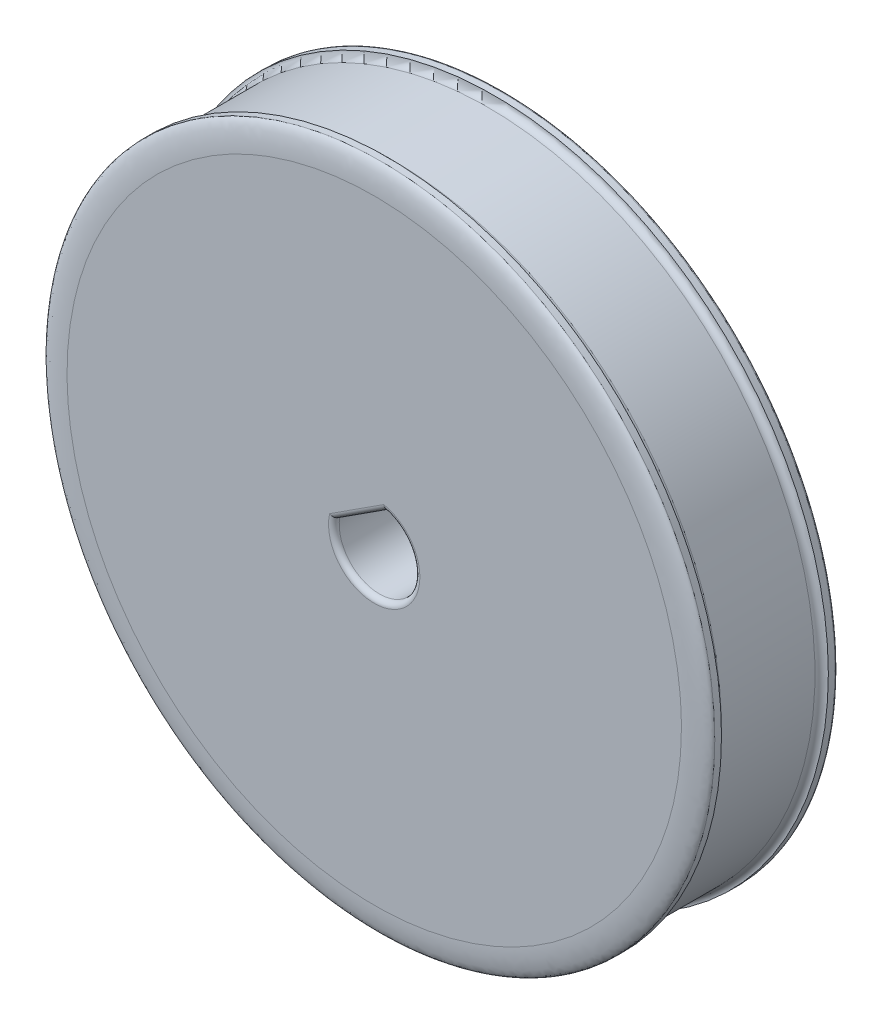
ISO-10303-21;
HEADER;
FILE_DESCRIPTION(('STEP AP214'),'2;1');
FILE_NAME('part.step','',(''),(''),'','','');
FILE_SCHEMA(('AUTOMOTIVE_DESIGN { 1 0 10303 214 1 1 1 1 }'));
ENDSEC;
DATA;
#1=APPLICATION_CONTEXT('core data for automotive mechanical design processes');
#2=APPLICATION_PROTOCOL_DEFINITION('international standard','automotive_design',2000,#1);
#3=PRODUCT_CONTEXT('',#1,'mechanical');
#4=PRODUCT('Part','Part','',(#3));
#5=PRODUCT_RELATED_PRODUCT_CATEGORY('part','',(#4));
#6=PRODUCT_DEFINITION_FORMATION('','',#4);
#7=PRODUCT_DEFINITION_CONTEXT('part definition',#1,'design');
#8=PRODUCT_DEFINITION('design','',#6,#7);
#9=PRODUCT_DEFINITION_SHAPE('','',#8);
#10=(LENGTH_UNIT() NAMED_UNIT(*) SI_UNIT(.MILLI.,.METRE.));
#11=(NAMED_UNIT(*) PLANE_ANGLE_UNIT() SI_UNIT($,.RADIAN.));
#12=(NAMED_UNIT(*) SI_UNIT($,.STERADIAN.) SOLID_ANGLE_UNIT());
#13=UNCERTAINTY_MEASURE_WITH_UNIT(LENGTH_MEASURE(1.E-05),#10,'distance_accuracy_value','');
#14=(GEOMETRIC_REPRESENTATION_CONTEXT(3) GLOBAL_UNCERTAINTY_ASSIGNED_CONTEXT((#13)) GLOBAL_UNIT_ASSIGNED_CONTEXT((#10,
#11,#12)) REPRESENTATION_CONTEXT('',''));
#15=CARTESIAN_POINT('',(0.,0.,0.));
#16=DIRECTION('',(0.,0.,1.));
#17=DIRECTION('',(1.,0.,0.));
#18=AXIS2_PLACEMENT_3D('',#15,#16,#17);
#19=CARTESIAN_POINT('',(0.,0.,2.5));
#20=DIRECTION('',(0.,0.,-1.));
#21=DIRECTION('',(-1.,0.,0.));
#22=AXIS2_PLACEMENT_3D('',#19,#20,#21);
#23=PLANE('',#22);
#24=DIRECTION('',(-0.840032755054355,-0.54253568586388,0.));
#25=VECTOR('',#24,1.);
#26=CARTESIAN_POINT('',(0.286466249029064,1.62543443059609,2.5));
#27=LINE('',#26,#25);
#28=CARTESIAN_POINT('',(-1.67148361976043,0.360891270154601,2.5));
#29=VERTEX_POINT('',#28);
#30=CARTESIAN_POINT('',(0.358547259969844,1.67198799707694,2.5));
#31=VERTEX_POINT('',#30);
#32=EDGE_CURVE('E281',#29,#31,#27,.F.);
#33=ORIENTED_EDGE('',*,*,#32,.T.);
#34=CARTESIAN_POINT('',(0.,0.,2.5));
#35=DIRECTION('',(0.,0.,-1.));
#36=DIRECTION('',(-1.,0.,0.));
#37=AXIS2_PLACEMENT_3D('',#34,#35,#36);
#38=CIRCLE('',#37,1.71);
#39=EDGE_CURVE('E283',#31,#29,#38,.T.);
#40=ORIENTED_EDGE('',*,*,#39,.T.);
#41=EDGE_LOOP('',(#33,#40));
#42=FACE_BOUND('',#41,.T.);
#43=CARTESIAN_POINT('',(11.5,0.,2.5));
#44=CARTESIAN_POINT('',(11.5,-1.50534647794801,2.5));
#45=CARTESIAN_POINT('',(11.2006857809601,-3.0101006718852,2.5));
#46=CARTESIAN_POINT('',(10.0485434667996,-5.79161827251183,2.5));
#47=CARTESIAN_POINT('',(9.19616868623715,-7.06728728105344,2.5));
#48=CARTESIAN_POINT('',(7.06728728105343,-9.19616868623716,2.5));
#49=CARTESIAN_POINT('',(5.79161827251186,-10.0485434668009,2.5));
#50=CARTESIAN_POINT('',(3.01010067188524,-11.2006857809587,2.5));
#51=CARTESIAN_POINT('',(1.505346477948,-11.5,2.5));
#52=CARTESIAN_POINT('',(-1.50534647794802,-11.5,2.5));
#53=CARTESIAN_POINT('',(-3.01010067187739,-11.2006857809627,2.5));
#54=CARTESIAN_POINT('',(-5.79161827251968,-10.0485434667969,2.5));
#55=CARTESIAN_POINT('',(-7.06728728105475,-9.19616868623846,2.5));
#56=CARTESIAN_POINT('',(-9.19616868623586,-7.06728728105213,2.5));
#57=CARTESIAN_POINT('',(-10.0485434668005,-5.79161827251404,2.5));
#58=CARTESIAN_POINT('',(-11.2006857809591,-3.01010067188302,2.5));
#59=CARTESIAN_POINT('',(-11.5,-1.50534647794671,2.5));
#60=CARTESIAN_POINT('',(-11.5,1.50534647794671,2.5));
#61=CARTESIAN_POINT('',(-11.2006857809591,3.01010067188433,2.5));
#62=CARTESIAN_POINT('',(-10.0485434668005,5.79161827251274,2.5));
#63=CARTESIAN_POINT('',(-9.19616868623716,7.06728728105344,2.5));
#64=CARTESIAN_POINT('',(-7.06728728105344,9.19616868623716,2.5));
#65=CARTESIAN_POINT('',(-5.79161827251315,10.0485434667983,2.5));
#66=CARTESIAN_POINT('',(-3.01010067188391,11.2006857809614,2.5));
#67=CARTESIAN_POINT('',(-1.50534647794801,11.5,2.5));
#68=CARTESIAN_POINT('',(1.50534647794801,11.5,2.5));
#69=CARTESIAN_POINT('',(3.01010067188457,11.2006857809587,2.5));
#70=CARTESIAN_POINT('',(5.7916182725125,10.0485434668009,2.5));
#71=CARTESIAN_POINT('',(7.06728728105345,9.19616868623846,2.5));
#72=CARTESIAN_POINT('',(9.19616868623716,7.06728728105213,2.5));
#73=CARTESIAN_POINT('',(10.0485434667996,5.79161827251252,2.5));
#74=CARTESIAN_POINT('',(11.20068578096,3.01010067188458,2.5));
#75=CARTESIAN_POINT('',(11.5,1.50534647794801,2.5));
#76=CARTESIAN_POINT('',(11.5,0.,2.5));
#77=(BOUNDED_CURVE() B_SPLINE_CURVE(3,(#43,#44,#45,#46,#47,#48,#49,#50,#51,#52,#53,#54,#55,#56,
#57,#58,#59,#60,#61,#62,#63,#64,#65,#66,#67,#68,#69,#70,#71,#72,#73,#74,#75,#76),.UNSPECIFIED.,
.T.,.F.) B_SPLINE_CURVE_WITH_KNOTS((4,2,2,2,2,2,2,2,2,2,2,2,2,2,2,2,4),(-3.14159265358979,
-2.74889357189107,-2.35619449019234,-1.96349540849362,-1.5707963267949,-1.17809724509617,
-0.785398163397448,-0.392699081698724,0.,0.392699081698724,0.785398163397448,1.17809724509617,
1.5707963267949,1.96349540849362,2.35619449019234,2.74889357189107,3.14159265358979),
.UNSPECIFIED.) CURVE() GEOMETRIC_REPRESENTATION_ITEM() RATIONAL_B_SPLINE_CURVE((1.,1.,1.,1.,1.,
1.,1.,1.,1.,1.,1.,1.,1.,1.,1.,1.,1.,1.,1.,1.,1.,1.,1.,1.,1.,1.,1.,1.,1.,1.,1.,1.,1.,1.)) REPRESENTATION_ITEM(''));
#78=CARTESIAN_POINT('',(11.5,0.,2.5));
#79=VERTEX_POINT('',#78);
#80=EDGE_CURVE('E119',#79,#79,#77,.F.);
#81=ORIENTED_EDGE('',*,*,#80,.T.);
#82=EDGE_LOOP('',(#81));
#83=FACE_BOUND('',#82,.T.);
#84=ADVANCED_FACE('F49',(#42,#83),#23,.F.);
#85=CARTESIAN_POINT('',(0.,0.,-6.4));
#86=DIRECTION('',(0.,0.,-1.));
#87=DIRECTION('',(-0.840032755054355,-0.54253568586388,0.));
#88=AXIS2_PLACEMENT_3D('',#85,#86,#87);
#89=PLANE('',#88);
#90=CARTESIAN_POINT('',(0.,0.,-6.4));
#91=DIRECTION('',(0.,0.,-1.));
#92=DIRECTION('',(0.,1.,0.));
#93=AXIS2_PLACEMENT_3D('',#90,#91,#92);
#94=CIRCLE('',#93,3.00800156106464);
#95=CARTESIAN_POINT('',(0.,3.00800156106464,-6.4));
#96=VERTEX_POINT('',#95);
#97=EDGE_CURVE('E267',#96,#96,#94,.T.);
#98=ORIENTED_EDGE('',*,*,#97,.T.);
#99=EDGE_LOOP('',(#98));
#100=FACE_BOUND('',#99,.T.);
#101=CARTESIAN_POINT('',(0.,0.,-6.4));
#102=DIRECTION('',(0.,0.,-1.));
#103=DIRECTION('',(-1.,0.,0.));
#104=AXIS2_PLACEMENT_3D('',#101,#102,#103);
#105=CIRCLE('',#104,1.51);
#106=CARTESIAN_POINT('',(0.39497338620184,1.45742787958522,-6.4));
#107=VERTEX_POINT('',#106);
#108=CARTESIAN_POINT('',(-1.49089547164688,0.239438285624584,-6.4));
#109=VERTEX_POINT('',#108);
#110=EDGE_CURVE('E99',#107,#109,#105,.T.);
#111=ORIENTED_EDGE('',*,*,#110,.F.);
#112=DIRECTION('',(-0.840032755054355,-0.54253568586388,0.));
#113=VECTOR('',#112,1.);
#114=CARTESIAN_POINT('',(-0.547961042722519,0.848433082604899,-6.4));
#115=LINE('',#114,#113);
#116=EDGE_CURVE('E92',#107,#109,#115,.T.);
#117=ORIENTED_EDGE('',*,*,#116,.T.);
#118=EDGE_LOOP('',(#111,#117));
#119=FACE_BOUND('',#118,.T.);
#120=ADVANCED_FACE('F103',(#100,#119),#89,.T.);
#121=CARTESIAN_POINT('',(11.5,0.,-2.5));
#122=CARTESIAN_POINT('',(11.5,-1.50534647794801,-2.5));
#123=CARTESIAN_POINT('',(11.2006857809601,-3.0101006718852,-2.5));
#124=CARTESIAN_POINT('',(10.0485434667996,-5.79161827251183,-2.5));
#125=CARTESIAN_POINT('',(9.19616868623715,-7.06728728105344,-2.5));
#126=CARTESIAN_POINT('',(7.06728728105343,-9.19616868623716,-2.5));
#127=CARTESIAN_POINT('',(5.79161827251186,-10.0485434668009,-2.5));
#128=CARTESIAN_POINT('',(3.01010067188524,-11.2006857809587,-2.5));
#129=CARTESIAN_POINT('',(1.505346477948,-11.5,-2.5));
#130=CARTESIAN_POINT('',(-1.50534647794802,-11.5,-2.5));
#131=CARTESIAN_POINT('',(-3.01010067187739,-11.2006857809627,-2.5));
#132=CARTESIAN_POINT('',(-5.79161827251968,-10.0485434667969,-2.5));
#133=CARTESIAN_POINT('',(-7.06728728105475,-9.19616868623846,-2.5));
#134=CARTESIAN_POINT('',(-9.19616868623586,-7.06728728105213,-2.5));
#135=CARTESIAN_POINT('',(-10.0485434668005,-5.79161827251404,-2.5));
#136=CARTESIAN_POINT('',(-11.2006857809591,-3.01010067188302,-2.5));
#137=CARTESIAN_POINT('',(-11.5,-1.50534647794671,-2.5));
#138=CARTESIAN_POINT('',(-11.5,1.50534647794671,-2.5));
#139=CARTESIAN_POINT('',(-11.2006857809591,3.01010067188433,-2.5));
#140=CARTESIAN_POINT('',(-10.0485434668005,5.79161827251274,-2.5));
#141=CARTESIAN_POINT('',(-9.19616868623716,7.06728728105344,-2.5));
#142=CARTESIAN_POINT('',(-7.06728728105344,9.19616868623716,-2.5));
#143=CARTESIAN_POINT('',(-5.79161827251315,10.0485434667983,-2.5));
#144=CARTESIAN_POINT('',(-3.01010067188391,11.2006857809614,-2.5));
#145=CARTESIAN_POINT('',(-1.50534647794801,11.5,-2.5));
#146=CARTESIAN_POINT('',(1.50534647794801,11.5,-2.5));
#147=CARTESIAN_POINT('',(3.01010067188457,11.2006857809587,-2.5));
#148=CARTESIAN_POINT('',(5.7916182725125,10.0485434668009,-2.5));
#149=CARTESIAN_POINT('',(7.06728728105345,9.19616868623846,-2.5));
#150=CARTESIAN_POINT('',(9.19616868623716,7.06728728105213,-2.5));
#151=CARTESIAN_POINT('',(10.0485434667996,5.79161827251252,-2.5));
#152=CARTESIAN_POINT('',(11.20068578096,3.01010067188458,-2.5));
#153=CARTESIAN_POINT('',(11.5,1.50534647794801,-2.5));
#154=CARTESIAN_POINT('',(11.5,0.,-2.5));
#155=CARTESIAN_POINT('',(12.5,0.,-2.5));
#156=CARTESIAN_POINT('',(12.5,-1.63624617168262,-2.5));
#157=CARTESIAN_POINT('',(12.1746584575656,-3.27184855639753,-2.5000000000049));
#158=CARTESIAN_POINT('',(10.9223298552166,-6.29523725272969,-2.4999999999951));
#159=CARTESIAN_POINT('',(9.99583552851893,-7.68183400114607,-2.5));
#160=CARTESIAN_POINT('',(7.68183400114475,-9.99583552851763,-2.5));
#161=CARTESIAN_POINT('',(6.29523725272972,-10.9223298552179,-2.4999999999951));
#162=CARTESIAN_POINT('',(3.27184855639756,-12.1746584575643,-2.5000000000049));
#163=CARTESIAN_POINT('',(1.63624617168261,-12.5,-2.5));
#164=CARTESIAN_POINT('',(-1.63624617168263,-12.5,-2.5));
#165=CARTESIAN_POINT('',(-3.27184855638776,-12.1746584575682,-2.4999999999951));
#166=CARTESIAN_POINT('',(-6.2952372527395,-10.922329855214,-2.5000000000049));
#167=CARTESIAN_POINT('',(-7.68183400114607,-9.99583552852024,-2.5));
#168=CARTESIAN_POINT('',(-9.99583552851764,-7.68183400114345,-2.5));
#169=CARTESIAN_POINT('',(-10.9223298552188,-6.29523725273328,-2.5000000000049));
#170=CARTESIAN_POINT('',(-12.1746584575634,-3.27184855639397,-2.4999999999951));
#171=CARTESIAN_POINT('',(-12.5,-1.6362461716812,-2.5));
#172=CARTESIAN_POINT('',(-12.5,1.6362461716812,-2.5));
#173=CARTESIAN_POINT('',(-12.1746584575634,3.27184855639658,-2.5));
#174=CARTESIAN_POINT('',(-10.9223298552188,6.29523725273067,-2.5));
#175=CARTESIAN_POINT('',(-9.99583552851893,7.68183400114476,-2.5));
#176=CARTESIAN_POINT('',(-7.68183400114476,9.99583552851893,-2.5));
#177=CARTESIAN_POINT('',(-6.29523725273166,10.9223298552166,-2.50000000000001));
#178=CARTESIAN_POINT('',(-3.27184855639558,12.1746584575656,-2.50000000000001));
#179=CARTESIAN_POINT('',(-1.63624617168262,12.5,-2.5));
#180=CARTESIAN_POINT('',(1.63624617168262,12.5,-2.5));
#181=CARTESIAN_POINT('',(3.27184855639559,12.174658457563,-2.4999999999951));
#182=CARTESIAN_POINT('',(6.29523725273167,10.9223298552192,-2.5000000000049));
#183=CARTESIAN_POINT('',(7.68183400114607,9.99583552852024,-2.5));
#184=CARTESIAN_POINT('',(9.99583552851764,7.68183400114345,-2.5));
#185=CARTESIAN_POINT('',(10.9223298552166,6.29523725273037,-2.4999999999951));
#186=CARTESIAN_POINT('',(12.1746584575656,3.27184855639691,-2.5000000000049));
#187=CARTESIAN_POINT('',(12.5,1.63624617168262,-2.5));
#188=CARTESIAN_POINT('',(12.5,0.,-2.5));
#189=CARTESIAN_POINT('',(12.5,0.,-2.25));
#190=CARTESIAN_POINT('',(12.5,-1.63624617168262,-2.25));
#191=CARTESIAN_POINT('',(12.1746584575647,-3.27184855639648,-2.25));
#192=CARTESIAN_POINT('',(10.9223298552175,-6.29523725273073,-2.25));
#193=CARTESIAN_POINT('',(9.99583552851828,-7.68183400114542,-2.25));
#194=CARTESIAN_POINT('',(7.6818340011454,-9.99583552851829,-2.25));
#195=CARTESIAN_POINT('',(6.2952372527303,-10.9223298552177,-2.25));
#196=CARTESIAN_POINT('',(3.27184855639698,-12.1746584575645,-2.25));
#197=CARTESIAN_POINT('',(1.63624617168261,-12.5,-2.25));
#198=CARTESIAN_POINT('',(-1.63624617168263,-12.5,-2.25));
#199=CARTESIAN_POINT('',(-3.27184855638834,-12.174658457568,-2.25));
#200=CARTESIAN_POINT('',(-6.29523725273892,-10.9223298552141,-2.25));
#201=CARTESIAN_POINT('',(-7.68183400114477,-9.99583552851893,-2.25));
#202=CARTESIAN_POINT('',(-9.99583552851894,-7.68183400114475,-2.25));
#203=CARTESIAN_POINT('',(-10.922329855217,-6.2952372527319,-2.25));
#204=CARTESIAN_POINT('',(-12.1746584575651,-3.27184855639534,-2.25));
#205=CARTESIAN_POINT('',(-12.5,-1.6362461716812,-2.25));
#206=CARTESIAN_POINT('',(-12.5,1.6362461716812,-2.25));
#207=CARTESIAN_POINT('',(-12.1746584575645,3.27184855639702,-2.25));
#208=CARTESIAN_POINT('',(-10.9223298552177,6.29523725273023,-2.25));
#209=CARTESIAN_POINT('',(-9.99583552851893,7.68183400114476,-2.25));
#210=CARTESIAN_POINT('',(-7.68183400114476,9.99583552851893,-2.25));
#211=CARTESIAN_POINT('',(-6.29523725273186,10.9223298552171,-2.25));
#212=CARTESIAN_POINT('',(-3.27184855639538,12.1746584575651,-2.25));
#213=CARTESIAN_POINT('',(-1.63624617168262,12.5,-2.25));
#214=CARTESIAN_POINT('',(1.63624617168262,12.5,-2.25));
#215=CARTESIAN_POINT('',(3.27184855639687,12.1746584575645,-2.25));
#216=CARTESIAN_POINT('',(6.29523725273038,10.9223298552177,-2.25));
#217=CARTESIAN_POINT('',(7.68183400114477,9.99583552851893,-2.25));
#218=CARTESIAN_POINT('',(9.99583552851894,7.68183400114475,-2.25));
#219=CARTESIAN_POINT('',(10.9223298552173,6.29523725273132,-2.25));
#220=CARTESIAN_POINT('',(12.1746584575649,3.27184855639596,-2.25));
#221=CARTESIAN_POINT('',(12.5,1.63624617168262,-2.25));
#222=CARTESIAN_POINT('',(12.5,0.,-2.25));
#223=(BOUNDED_SURFACE() B_SPLINE_SURFACE(2,3,((#121,#122,#123,#124,#125,#126,#127,#128,#129,
#130,#131,#132,#133,#134,#135,#136,#137,#138,#139,#140,#141,#142,#143,#144,#145,#146,#147,#148,
#149,#150,#151,#152,#153,#154),(#155,#156,#157,#158,#159,#160,#161,#162,#163,#164,#165,#166,
#167,#168,#169,#170,#171,#172,#173,#174,#175,#176,#177,#178,#179,#180,#181,#182,#183,#184,#185,
#186,#187,#188),(#189,#190,#191,#192,#193,#194,#195,#196,#197,#198,#199,#200,#201,#202,#203,
#204,#205,#206,#207,#208,#209,#210,#211,#212,#213,#214,#215,#216,#217,#218,#219,#220,#221,
#222)),.UNSPECIFIED.,.F.,.T.,.F.) B_SPLINE_SURFACE_WITH_KNOTS((3,3),(4,2,2,2,2,2,2,2,2,2,2,2,2,
2,2,2,4),(0.,1.),(-3.14159265358979,-2.74889357189107,-2.35619449019234,-1.96349540849362,
-1.5707963267949,-1.17809724509617,-0.785398163397448,-0.392699081698724,0.,0.392699081698724,
0.785398163397448,1.17809724509617,1.5707963267949,1.96349540849362,2.35619449019234,
2.74889357189107,3.14159265358979),
.UNSPECIFIED.) GEOMETRIC_REPRESENTATION_ITEM() RATIONAL_B_SPLINE_SURFACE(((1.,1.,1.,1.,1.,1.,1.,
1.,1.,1.,1.,1.,1.,1.,1.,1.,1.,1.,1.,1.,1.,1.,1.,1.,1.,1.,1.,1.,1.,1.,1.,1.,1.,1.),
(0.707106781186548,0.707106781186548,0.707106781186548,0.707106781186548,0.707106781186548,
0.707106781186548,0.707106781186548,0.707106781186548,0.707106781186548,0.707106781186548,
0.707106781186548,0.707106781186548,0.707106781186548,0.707106781186548,0.707106781186548,
0.707106781186548,0.707106781186548,0.707106781186548,0.707106781186548,0.707106781186548,
0.707106781186548,0.707106781186548,0.707106781186545,0.707106781186545,0.707106781186548,
0.707106781186548,0.707106781186548,0.707106781186548,0.707106781186548,0.707106781186548,
0.707106781186548,0.707106781186548,0.707106781186548,0.707106781186548),(1.,1.,1.,1.,1.,1.,1.,
1.,1.,1.,1.,1.,1.,1.,1.,1.,1.,1.,1.,1.,1.,1.,1.,1.,1.,1.,1.,1.,1.,1.,1.,1.,1.,1.))) REPRESENTATION_ITEM('') SURFACE());
#224=CARTESIAN_POINT('',(11.5,0.,-2.5));
#225=CARTESIAN_POINT('',(11.5,1.50534647794801,-2.5));
#226=CARTESIAN_POINT('',(11.20068578096,3.01010067188458,-2.5));
#227=CARTESIAN_POINT('',(10.0485434667996,5.79161827251252,-2.5));
#228=CARTESIAN_POINT('',(9.19616868623716,7.06728728105213,-2.5));
#229=CARTESIAN_POINT('',(7.06728728105345,9.19616868623846,-2.5));
#230=CARTESIAN_POINT('',(5.7916182725125,10.0485434668009,-2.5));
#231=CARTESIAN_POINT('',(3.01010067188457,11.2006857809587,-2.5));
#232=CARTESIAN_POINT('',(1.50534647794801,11.5,-2.5));
#233=CARTESIAN_POINT('',(-1.50534647794801,11.5,-2.5));
#234=CARTESIAN_POINT('',(-3.01010067188391,11.2006857809614,-2.5));
#235=CARTESIAN_POINT('',(-5.79161827251315,10.0485434667983,-2.5));
#236=CARTESIAN_POINT('',(-7.06728728105344,9.19616868623716,-2.5));
#237=CARTESIAN_POINT('',(-9.19616868623716,7.06728728105344,-2.5));
#238=CARTESIAN_POINT('',(-10.0485434668005,5.79161827251274,-2.5));
#239=CARTESIAN_POINT('',(-11.2006857809591,3.01010067188433,-2.5));
#240=CARTESIAN_POINT('',(-11.5,1.50534647794671,-2.5));
#241=CARTESIAN_POINT('',(-11.5,-1.50534647794671,-2.5));
#242=CARTESIAN_POINT('',(-11.2006857809591,-3.01010067188302,-2.5));
#243=CARTESIAN_POINT('',(-10.0485434668005,-5.79161827251404,-2.5));
#244=CARTESIAN_POINT('',(-9.19616868623586,-7.06728728105213,-2.5));
#245=CARTESIAN_POINT('',(-7.06728728105475,-9.19616868623846,-2.5));
#246=CARTESIAN_POINT('',(-5.79161827251968,-10.0485434667969,-2.5));
#247=CARTESIAN_POINT('',(-3.01010067187739,-11.2006857809627,-2.5));
#248=CARTESIAN_POINT('',(-1.50534647794802,-11.5,-2.5));
#249=CARTESIAN_POINT('',(1.505346477948,-11.5,-2.5));
#250=CARTESIAN_POINT('',(3.01010067188524,-11.2006857809587,-2.5));
#251=CARTESIAN_POINT('',(5.79161827251186,-10.0485434668009,-2.5));
#252=CARTESIAN_POINT('',(7.06728728105343,-9.19616868623716,-2.5));
#253=CARTESIAN_POINT('',(9.19616868623715,-7.06728728105344,-2.5));
#254=CARTESIAN_POINT('',(10.0485434667996,-5.79161827251183,-2.5));
#255=CARTESIAN_POINT('',(11.2006857809601,-3.0101006718852,-2.5));
#256=CARTESIAN_POINT('',(11.5,-1.50534647794801,-2.5));
#257=CARTESIAN_POINT('',(11.5,0.,-2.5));
#258=(BOUNDED_CURVE() B_SPLINE_CURVE(3,(#224,#225,#226,#227,#228,#229,#230,#231,#232,#233,#234,
#235,#236,#237,#238,#239,#240,#241,#242,#243,#244,#245,#246,#247,#248,#249,#250,#251,#252,#253,
#254,#255,#256,#257),.UNSPECIFIED.,.T.,.F.) B_SPLINE_CURVE_WITH_KNOTS((4,2,2,2,2,2,2,2,2,2,2,2,
2,2,2,2,4),(-3.14159265358979,-2.74889357189107,-2.35619449019234,-1.96349540849362,
-1.5707963267949,-1.17809724509617,-0.785398163397448,-0.392699081698724,0.,0.392699081698724,
0.785398163397448,1.17809724509617,1.5707963267949,1.96349540849362,2.35619449019234,
2.74889357189107,3.14159265358979),
.UNSPECIFIED.) CURVE() GEOMETRIC_REPRESENTATION_ITEM() RATIONAL_B_SPLINE_CURVE((1.,1.,1.,1.,1.,
1.,1.,1.,1.,1.,1.,1.,1.,1.,1.,1.,1.,1.,1.,1.,1.,1.,1.,1.,1.,1.,1.,1.,1.,1.,1.,1.,1.,1.)) REPRESENTATION_ITEM(''));
#259=CARTESIAN_POINT('',(11.5,0.,-2.5));
#260=VERTEX_POINT('',#259);
#261=EDGE_CURVE('E225',#260,#260,#258,.F.);
#262=CARTESIAN_POINT('',(12.5,0.,-2.25));
#263=CARTESIAN_POINT('',(12.5,-1.63624617168262,-2.25));
#264=CARTESIAN_POINT('',(12.1746584575647,-3.27184855639648,-2.25));
#265=CARTESIAN_POINT('',(10.9223298552175,-6.29523725273073,-2.25));
#266=CARTESIAN_POINT('',(9.99583552851828,-7.68183400114542,-2.25));
#267=CARTESIAN_POINT('',(7.6818340011454,-9.99583552851829,-2.25));
#268=CARTESIAN_POINT('',(6.2952372527303,-10.9223298552177,-2.25));
#269=CARTESIAN_POINT('',(3.27184855639698,-12.1746584575645,-2.25));
#270=CARTESIAN_POINT('',(1.63624617168261,-12.5,-2.25));
#271=CARTESIAN_POINT('',(-1.63624617168263,-12.5,-2.25));
#272=CARTESIAN_POINT('',(-3.27184855638834,-12.174658457568,-2.25));
#273=CARTESIAN_POINT('',(-6.29523725273892,-10.9223298552141,-2.25));
#274=CARTESIAN_POINT('',(-7.68183400114477,-9.99583552851893,-2.25));
#275=CARTESIAN_POINT('',(-9.99583552851894,-7.68183400114475,-2.25));
#276=CARTESIAN_POINT('',(-10.922329855217,-6.2952372527319,-2.25));
#277=CARTESIAN_POINT('',(-12.1746584575651,-3.27184855639534,-2.25));
#278=CARTESIAN_POINT('',(-12.5,-1.6362461716812,-2.25));
#279=CARTESIAN_POINT('',(-12.5,1.6362461716812,-2.25));
#280=CARTESIAN_POINT('',(-12.1746584575645,3.27184855639702,-2.25));
#281=CARTESIAN_POINT('',(-10.9223298552177,6.29523725273023,-2.25));
#282=CARTESIAN_POINT('',(-9.99583552851893,7.68183400114476,-2.25));
#283=CARTESIAN_POINT('',(-7.68183400114476,9.99583552851893,-2.25));
#284=CARTESIAN_POINT('',(-6.29523725273186,10.9223298552171,-2.25));
#285=CARTESIAN_POINT('',(-3.27184855639538,12.1746584575651,-2.25));
#286=CARTESIAN_POINT('',(-1.63624617168262,12.5,-2.25));
#287=CARTESIAN_POINT('',(1.63624617168262,12.5,-2.25));
#288=CARTESIAN_POINT('',(3.27184855639687,12.1746584575645,-2.25));
#289=CARTESIAN_POINT('',(6.29523725273038,10.9223298552177,-2.25));
#290=CARTESIAN_POINT('',(7.68183400114477,9.99583552851893,-2.25));
#291=CARTESIAN_POINT('',(9.99583552851894,7.68183400114475,-2.25));
#292=CARTESIAN_POINT('',(10.9223298552173,6.29523725273132,-2.25));
#293=CARTESIAN_POINT('',(12.1746584575649,3.27184855639596,-2.25));
#294=CARTESIAN_POINT('',(12.5,1.63624617168262,-2.25));
#295=CARTESIAN_POINT('',(12.5,0.,-2.25));
#296=(BOUNDED_CURVE() B_SPLINE_CURVE(3,(#262,#263,#264,#265,#266,#267,#268,#269,#270,#271,#272,
#273,#274,#275,#276,#277,#278,#279,#280,#281,#282,#283,#284,#285,#286,#287,#288,#289,#290,#291,
#292,#293,#294,#295),.UNSPECIFIED.,.T.,.F.) B_SPLINE_CURVE_WITH_KNOTS((4,2,2,2,2,2,2,2,2,2,2,2,
2,2,2,2,4),(-3.14159265358979,-2.74889357189107,-2.35619449019234,-1.96349540849362,
-1.5707963267949,-1.17809724509617,-0.785398163397448,-0.392699081698724,0.,0.392699081698724,
0.785398163397448,1.17809724509617,1.5707963267949,1.96349540849362,2.35619449019234,
2.74889357189107,3.14159265358979),
.UNSPECIFIED.) CURVE() GEOMETRIC_REPRESENTATION_ITEM() RATIONAL_B_SPLINE_CURVE((1.,1.,1.,1.,1.,
1.,1.,1.,1.,1.,1.,1.,1.,1.,1.,1.,1.,1.,1.,1.,1.,1.,1.,1.,1.,1.,1.,1.,1.,1.,1.,1.,1.,1.)) REPRESENTATION_ITEM(''));
#297=CARTESIAN_POINT('',(12.5,0.,-2.25));
#298=VERTEX_POINT('',#297);
#299=EDGE_CURVE('E238',#298,#298,#296,.F.);
#300=ORIENTED_EDGE('',*,*,#261,.F.);
#301=EDGE_LOOP('',(#300));
#302=FACE_BOUND('',#301,.T.);
#303=ORIENTED_EDGE('',*,*,#299,.F.);
#304=EDGE_LOOP('',(#303));
#305=FACE_BOUND('',#304,.T.);
#306=ADVANCED_FACE('F157',(#302,#305),#223,.T.);
#307=CARTESIAN_POINT('',(12.5,0.,2.25));
#308=CARTESIAN_POINT('',(12.5,-1.63624617168262,2.25));
#309=CARTESIAN_POINT('',(12.1746584575647,-3.27184855639648,2.25));
#310=CARTESIAN_POINT('',(10.9223298552175,-6.29523725273073,2.25));
#311=CARTESIAN_POINT('',(9.99583552851828,-7.68183400114542,2.25));
#312=CARTESIAN_POINT('',(7.6818340011454,-9.99583552851829,2.25));
#313=CARTESIAN_POINT('',(6.2952372527303,-10.9223298552177,2.25));
#314=CARTESIAN_POINT('',(3.27184855639698,-12.1746584575645,2.25));
#315=CARTESIAN_POINT('',(1.63624617168261,-12.5,2.25));
#316=CARTESIAN_POINT('',(-1.63624617168263,-12.5,2.25));
#317=CARTESIAN_POINT('',(-3.27184855638834,-12.174658457568,2.25));
#318=CARTESIAN_POINT('',(-6.29523725273892,-10.9223298552141,2.25));
#319=CARTESIAN_POINT('',(-7.68183400114477,-9.99583552851893,2.25));
#320=CARTESIAN_POINT('',(-9.99583552851894,-7.68183400114475,2.25));
#321=CARTESIAN_POINT('',(-10.922329855217,-6.2952372527319,2.25));
#322=CARTESIAN_POINT('',(-12.1746584575651,-3.27184855639534,2.25));
#323=CARTESIAN_POINT('',(-12.5,-1.6362461716812,2.25));
#324=CARTESIAN_POINT('',(-12.5,1.6362461716812,2.25));
#325=CARTESIAN_POINT('',(-12.1746584575645,3.27184855639702,2.25));
#326=CARTESIAN_POINT('',(-10.9223298552177,6.29523725273023,2.25));
#327=CARTESIAN_POINT('',(-9.99583552851893,7.68183400114476,2.25));
#328=CARTESIAN_POINT('',(-7.68183400114476,9.99583552851893,2.25));
#329=CARTESIAN_POINT('',(-6.29523725273186,10.9223298552171,2.25));
#330=CARTESIAN_POINT('',(-3.27184855639538,12.1746584575651,2.25));
#331=CARTESIAN_POINT('',(-1.63624617168262,12.5,2.25));
#332=CARTESIAN_POINT('',(1.63624617168262,12.5,2.25));
#333=CARTESIAN_POINT('',(3.27184855639687,12.1746584575645,2.25));
#334=CARTESIAN_POINT('',(6.29523725273038,10.9223298552177,2.25));
#335=CARTESIAN_POINT('',(7.68183400114477,9.99583552851893,2.25));
#336=CARTESIAN_POINT('',(9.99583552851894,7.68183400114475,2.25));
#337=CARTESIAN_POINT('',(10.9223298552173,6.29523725273132,2.25));
#338=CARTESIAN_POINT('',(12.1746584575649,3.27184855639596,2.25));
#339=CARTESIAN_POINT('',(12.5,1.63624617168262,2.25));
#340=CARTESIAN_POINT('',(12.5,0.,2.25));
#341=CARTESIAN_POINT('',(12.5,0.,2.5));
#342=CARTESIAN_POINT('',(12.5,-1.63624617168262,2.5));
#343=CARTESIAN_POINT('',(12.1746584575656,-3.27184855639753,2.50000000000489));
#344=CARTESIAN_POINT('',(10.9223298552166,-6.29523725272969,2.4999999999951));
#345=CARTESIAN_POINT('',(9.99583552851893,-7.68183400114607,2.5));
#346=CARTESIAN_POINT('',(7.68183400114475,-9.99583552851763,2.5));
#347=CARTESIAN_POINT('',(6.29523725272972,-10.9223298552179,2.4999999999951));
#348=CARTESIAN_POINT('',(3.27184855639756,-12.1746584575643,2.50000000000489));
#349=CARTESIAN_POINT('',(1.63624617168261,-12.5,2.5));
#350=CARTESIAN_POINT('',(-1.63624617168263,-12.5,2.5));
#351=CARTESIAN_POINT('',(-3.27184855638776,-12.1746584575682,2.4999999999951));
#352=CARTESIAN_POINT('',(-6.2952372527395,-10.922329855214,2.50000000000489));
#353=CARTESIAN_POINT('',(-7.68183400114607,-9.99583552852024,2.5));
#354=CARTESIAN_POINT('',(-9.99583552851764,-7.68183400114345,2.5));
#355=CARTESIAN_POINT('',(-10.9223298552188,-6.29523725273328,2.50000000000489));
#356=CARTESIAN_POINT('',(-12.1746584575634,-3.27184855639397,2.4999999999951));
#357=CARTESIAN_POINT('',(-12.5,-1.6362461716812,2.5));
#358=CARTESIAN_POINT('',(-12.5,1.6362461716812,2.5));
#359=CARTESIAN_POINT('',(-12.1746584575634,3.27184855639658,2.5));
#360=CARTESIAN_POINT('',(-10.9223298552188,6.29523725273067,2.5));
#361=CARTESIAN_POINT('',(-9.99583552851893,7.68183400114476,2.5));
#362=CARTESIAN_POINT('',(-7.68183400114476,9.99583552851893,2.5));
#363=CARTESIAN_POINT('',(-6.29523725273166,10.9223298552166,2.5));
#364=CARTESIAN_POINT('',(-3.27184855639558,12.1746584575656,2.5));
#365=CARTESIAN_POINT('',(-1.63624617168262,12.5,2.5));
#366=CARTESIAN_POINT('',(1.63624617168262,12.5,2.5));
#367=CARTESIAN_POINT('',(3.27184855639559,12.174658457563,2.4999999999951));
#368=CARTESIAN_POINT('',(6.29523725273167,10.9223298552192,2.50000000000489));
#369=CARTESIAN_POINT('',(7.68183400114607,9.99583552852024,2.5));
#370=CARTESIAN_POINT('',(9.99583552851764,7.68183400114345,2.5));
#371=CARTESIAN_POINT('',(10.9223298552166,6.29523725273037,2.4999999999951));
#372=CARTESIAN_POINT('',(12.1746584575656,3.27184855639691,2.50000000000489));
#373=CARTESIAN_POINT('',(12.5,1.63624617168262,2.5));
#374=CARTESIAN_POINT('',(12.5,0.,2.5));
#375=CARTESIAN_POINT('',(11.5,0.,2.5));
#376=CARTESIAN_POINT('',(11.5,-1.50534647794801,2.5));
#377=CARTESIAN_POINT('',(11.2006857809601,-3.0101006718852,2.5));
#378=CARTESIAN_POINT('',(10.0485434667996,-5.79161827251183,2.5));
#379=CARTESIAN_POINT('',(9.19616868623715,-7.06728728105344,2.5));
#380=CARTESIAN_POINT('',(7.06728728105343,-9.19616868623716,2.5));
#381=CARTESIAN_POINT('',(5.79161827251186,-10.0485434668009,2.5));
#382=CARTESIAN_POINT('',(3.01010067188524,-11.2006857809587,2.5));
#383=CARTESIAN_POINT('',(1.505346477948,-11.5,2.5));
#384=CARTESIAN_POINT('',(-1.50534647794802,-11.5,2.5));
#385=CARTESIAN_POINT('',(-3.01010067187739,-11.2006857809627,2.5));
#386=CARTESIAN_POINT('',(-5.79161827251968,-10.0485434667969,2.5));
#387=CARTESIAN_POINT('',(-7.06728728105475,-9.19616868623846,2.5));
#388=CARTESIAN_POINT('',(-9.19616868623586,-7.06728728105213,2.5));
#389=CARTESIAN_POINT('',(-10.0485434668005,-5.79161827251404,2.5));
#390=CARTESIAN_POINT('',(-11.2006857809591,-3.01010067188302,2.5));
#391=CARTESIAN_POINT('',(-11.5,-1.50534647794671,2.5));
#392=CARTESIAN_POINT('',(-11.5,1.50534647794671,2.5));
#393=CARTESIAN_POINT('',(-11.2006857809591,3.01010067188433,2.5));
#394=CARTESIAN_POINT('',(-10.0485434668005,5.79161827251274,2.5));
#395=CARTESIAN_POINT('',(-9.19616868623716,7.06728728105344,2.5));
#396=CARTESIAN_POINT('',(-7.06728728105344,9.19616868623716,2.5));
#397=CARTESIAN_POINT('',(-5.79161827251315,10.0485434667983,2.5));
#398=CARTESIAN_POINT('',(-3.01010067188391,11.2006857809614,2.5));
#399=CARTESIAN_POINT('',(-1.50534647794801,11.5,2.5));
#400=CARTESIAN_POINT('',(1.50534647794801,11.5,2.5));
#401=CARTESIAN_POINT('',(3.01010067188457,11.2006857809587,2.5));
#402=CARTESIAN_POINT('',(5.7916182725125,10.0485434668009,2.5));
#403=CARTESIAN_POINT('',(7.06728728105345,9.19616868623846,2.5));
#404=CARTESIAN_POINT('',(9.19616868623716,7.06728728105213,2.5));
#405=CARTESIAN_POINT('',(10.0485434667996,5.79161827251252,2.5));
#406=CARTESIAN_POINT('',(11.20068578096,3.01010067188458,2.5));
#407=CARTESIAN_POINT('',(11.5,1.50534647794801,2.5));
#408=CARTESIAN_POINT('',(11.5,0.,2.5));
#409=(BOUNDED_SURFACE() B_SPLINE_SURFACE(2,3,((#307,#308,#309,#310,#311,#312,#313,#314,#315,
#316,#317,#318,#319,#320,#321,#322,#323,#324,#325,#326,#327,#328,#329,#330,#331,#332,#333,#334,
#335,#336,#337,#338,#339,#340),(#341,#342,#343,#344,#345,#346,#347,#348,#349,#350,#351,#352,
#353,#354,#355,#356,#357,#358,#359,#360,#361,#362,#363,#364,#365,#366,#367,#368,#369,#370,#371,
#372,#373,#374),(#375,#376,#377,#378,#379,#380,#381,#382,#383,#384,#385,#386,#387,#388,#389,
#390,#391,#392,#393,#394,#395,#396,#397,#398,#399,#400,#401,#402,#403,#404,#405,#406,#407,
#408)),.UNSPECIFIED.,.F.,.T.,.F.) B_SPLINE_SURFACE_WITH_KNOTS((3,3),(4,2,2,2,2,2,2,2,2,2,2,2,2,
2,2,2,4),(0.,1.),(-3.14159265358979,-2.74889357189107,-2.35619449019234,-1.96349540849362,
-1.5707963267949,-1.17809724509617,-0.785398163397448,-0.392699081698724,0.,0.392699081698724,
0.785398163397448,1.17809724509617,1.5707963267949,1.96349540849362,2.35619449019234,
2.74889357189107,3.14159265358979),
.UNSPECIFIED.) GEOMETRIC_REPRESENTATION_ITEM() RATIONAL_B_SPLINE_SURFACE(((1.,1.,1.,1.,1.,1.,1.,
1.,1.,1.,1.,1.,1.,1.,1.,1.,1.,1.,1.,1.,1.,1.,1.,1.,1.,1.,1.,1.,1.,1.,1.,1.,1.,1.),
(0.707106781186548,0.707106781186548,0.707106781186548,0.707106781186548,0.707106781186548,
0.707106781186548,0.707106781186548,0.707106781186548,0.707106781186548,0.707106781186548,
0.707106781186548,0.707106781186548,0.707106781186548,0.707106781186548,0.707106781186548,
0.707106781186548,0.707106781186548,0.707106781186548,0.707106781186548,0.707106781186548,
0.707106781186548,0.707106781186548,0.707106781186545,0.707106781186545,0.707106781186548,
0.707106781186548,0.707106781186548,0.707106781186548,0.707106781186548,0.707106781186548,
0.707106781186548,0.707106781186548,0.707106781186548,0.707106781186548),(1.,1.,1.,1.,1.,1.,1.,
1.,1.,1.,1.,1.,1.,1.,1.,1.,1.,1.,1.,1.,1.,1.,1.,1.,1.,1.,1.,1.,1.,1.,1.,1.,1.,1.))) REPRESENTATION_ITEM('') SURFACE());
#410=CARTESIAN_POINT('',(12.5,0.,2.25));
#411=CARTESIAN_POINT('',(12.5,1.63624617168262,2.25));
#412=CARTESIAN_POINT('',(12.1746584575649,3.27184855639596,2.25));
#413=CARTESIAN_POINT('',(10.9223298552173,6.29523725273132,2.25));
#414=CARTESIAN_POINT('',(9.99583552851894,7.68183400114475,2.25));
#415=CARTESIAN_POINT('',(7.68183400114477,9.99583552851893,2.25));
#416=CARTESIAN_POINT('',(6.29523725273038,10.9223298552177,2.25));
#417=CARTESIAN_POINT('',(3.27184855639687,12.1746584575645,2.25));
#418=CARTESIAN_POINT('',(1.63624617168262,12.5,2.25));
#419=CARTESIAN_POINT('',(-1.63624617168262,12.5,2.25));
#420=CARTESIAN_POINT('',(-3.27184855639538,12.1746584575651,2.25));
#421=CARTESIAN_POINT('',(-6.29523725273186,10.9223298552171,2.25));
#422=CARTESIAN_POINT('',(-7.68183400114476,9.99583552851893,2.25));
#423=CARTESIAN_POINT('',(-9.99583552851893,7.68183400114476,2.25));
#424=CARTESIAN_POINT('',(-10.9223298552177,6.29523725273023,2.25));
#425=CARTESIAN_POINT('',(-12.1746584575645,3.27184855639702,2.25));
#426=CARTESIAN_POINT('',(-12.5,1.6362461716812,2.25));
#427=CARTESIAN_POINT('',(-12.5,-1.6362461716812,2.25));
#428=CARTESIAN_POINT('',(-12.1746584575651,-3.27184855639534,2.25));
#429=CARTESIAN_POINT('',(-10.922329855217,-6.2952372527319,2.25));
#430=CARTESIAN_POINT('',(-9.99583552851894,-7.68183400114475,2.25));
#431=CARTESIAN_POINT('',(-7.68183400114477,-9.99583552851893,2.25));
#432=CARTESIAN_POINT('',(-6.29523725273892,-10.9223298552141,2.25));
#433=CARTESIAN_POINT('',(-3.27184855638834,-12.174658457568,2.25));
#434=CARTESIAN_POINT('',(-1.63624617168263,-12.5,2.25));
#435=CARTESIAN_POINT('',(1.63624617168261,-12.5,2.25));
#436=CARTESIAN_POINT('',(3.27184855639698,-12.1746584575645,2.25));
#437=CARTESIAN_POINT('',(6.2952372527303,-10.9223298552177,2.25));
#438=CARTESIAN_POINT('',(7.6818340011454,-9.99583552851829,2.25));
#439=CARTESIAN_POINT('',(9.99583552851828,-7.68183400114542,2.25));
#440=CARTESIAN_POINT('',(10.9223298552175,-6.29523725273073,2.25));
#441=CARTESIAN_POINT('',(12.1746584575647,-3.27184855639648,2.25));
#442=CARTESIAN_POINT('',(12.5,-1.63624617168262,2.25));
#443=CARTESIAN_POINT('',(12.5,0.,2.25));
#444=(BOUNDED_CURVE() B_SPLINE_CURVE(3,(#410,#411,#412,#413,#414,#415,#416,#417,#418,#419,#420,
#421,#422,#423,#424,#425,#426,#427,#428,#429,#430,#431,#432,#433,#434,#435,#436,#437,#438,#439,
#440,#441,#442,#443),.UNSPECIFIED.,.T.,.F.) B_SPLINE_CURVE_WITH_KNOTS((4,2,2,2,2,2,2,2,2,2,2,2,
2,2,2,2,4),(-3.14159265358979,-2.74889357189107,-2.35619449019234,-1.96349540849362,
-1.5707963267949,-1.17809724509617,-0.785398163397448,-0.392699081698724,0.,0.392699081698724,
0.785398163397448,1.17809724509617,1.5707963267949,1.96349540849362,2.35619449019234,
2.74889357189107,3.14159265358979),
.UNSPECIFIED.) CURVE() GEOMETRIC_REPRESENTATION_ITEM() RATIONAL_B_SPLINE_CURVE((1.,1.,1.,1.,1.,
1.,1.,1.,1.,1.,1.,1.,1.,1.,1.,1.,1.,1.,1.,1.,1.,1.,1.,1.,1.,1.,1.,1.,1.,1.,1.,1.,1.,1.)) REPRESENTATION_ITEM(''));
#445=CARTESIAN_POINT('',(12.5,0.,2.25));
#446=VERTEX_POINT('',#445);
#447=EDGE_CURVE('E263',#446,#446,#444,.F.);
#448=ORIENTED_EDGE('',*,*,#80,.F.);
#449=EDGE_LOOP('',(#448));
#450=FACE_BOUND('',#449,.T.);
#451=ORIENTED_EDGE('',*,*,#447,.F.);
#452=EDGE_LOOP('',(#451));
#453=FACE_BOUND('',#452,.T.);
#454=ADVANCED_FACE('F147',(#450,#453),#409,.T.);
#455=CARTESIAN_POINT('',(0.,0.,1.75));
#456=DIRECTION('',(0.,0.,-1.));
#457=DIRECTION('',(-1.,0.,0.));
#458=AXIS2_PLACEMENT_3D('',#455,#456,#457);
#459=TOROIDAL_SURFACE('',#458,12.5,0.249999999999999);
#460=CARTESIAN_POINT('',(0.,0.,1.75));
#461=DIRECTION('',(0.,0.,-1.));
#462=DIRECTION('',(-1.,0.,0.));
#463=AXIS2_PLACEMENT_3D('',#460,#461,#462);
#464=CIRCLE('',#463,12.25);
#465=CARTESIAN_POINT('',(-12.25,0.,1.75));
#466=VERTEX_POINT('',#465);
#467=EDGE_CURVE('E96',#466,#466,#464,.T.);
#468=ORIENTED_EDGE('',*,*,#467,.F.);
#469=EDGE_LOOP('',(#468));
#470=FACE_BOUND('',#469,.T.);
#471=CARTESIAN_POINT('',(0.,0.,2.));
#472=DIRECTION('',(0.,0.,-1.));
#473=DIRECTION('',(-1.,0.,0.));
#474=AXIS2_PLACEMENT_3D('',#471,#472,#473);
#475=CIRCLE('',#474,12.5);
#476=CARTESIAN_POINT('',(-12.5,0.,2.));
#477=VERTEX_POINT('',#476);
#478=EDGE_CURVE('E116',#477,#477,#475,.T.);
#479=ORIENTED_EDGE('',*,*,#478,.T.);
#480=EDGE_LOOP('',(#479));
#481=FACE_BOUND('',#480,.T.);
#482=ADVANCED_FACE('F143',(#470,#481),#459,.F.);
#483=CARTESIAN_POINT('',(0.,0.,3.5));
#484=DIRECTION('',(0.,0.,-1.));
#485=DIRECTION('',(-1.,0.,0.));
#486=AXIS2_PLACEMENT_3D('',#483,#484,#485);
#487=CYLINDRICAL_SURFACE('',#486,12.5);
#488=ORIENTED_EDGE('',*,*,#447,.T.);
#489=EDGE_LOOP('',(#488));
#490=FACE_BOUND('',#489,.T.);
#491=ORIENTED_EDGE('',*,*,#478,.F.);
#492=EDGE_LOOP('',(#491));
#493=FACE_BOUND('',#492,.T.);
#494=ADVANCED_FACE('F146',(#490,#493),#487,.T.);
#495=CARTESIAN_POINT('',(0.,0.,-2.5));
#496=DIRECTION('',(0.,0.,-1.));
#497=DIRECTION('',(-1.,0.,0.));
#498=AXIS2_PLACEMENT_3D('',#495,#496,#497);
#499=PLANE('',#498);
#500=CARTESIAN_POINT('',(0.,0.,-2.5));
#501=DIRECTION('',(0.,0.,-1.));
#502=DIRECTION('',(-1.,0.,0.));
#503=AXIS2_PLACEMENT_3D('',#500,#501,#502);
#504=CIRCLE('',#503,9.87749935930288);
#505=CARTESIAN_POINT('',(-9.87749935930288,0.,-2.5));
#506=VERTEX_POINT('',#505);
#507=EDGE_CURVE('E265',#506,#506,#504,.F.);
#508=ORIENTED_EDGE('',*,*,#507,.T.);
#509=EDGE_LOOP('',(#508));
#510=FACE_BOUND('',#509,.T.);
#511=ORIENTED_EDGE('',*,*,#261,.T.);
#512=EDGE_LOOP('',(#511));
#513=FACE_BOUND('',#512,.T.);
#514=ADVANCED_FACE('F140',(#510,#513),#499,.T.);
#515=ORIENTED_EDGE('',*,*,#299,.T.);
#516=EDGE_LOOP('',(#515));
#517=FACE_BOUND('',#516,.T.);
#518=CARTESIAN_POINT('',(0.,0.,-1.99999999999999));
#519=DIRECTION('',(0.,0.,-1.));
#520=DIRECTION('',(-1.,0.,0.));
#521=AXIS2_PLACEMENT_3D('',#518,#519,#520);
#522=CIRCLE('',#521,12.5);
#523=CARTESIAN_POINT('',(-12.5,0.,-1.99999999999999));
#524=VERTEX_POINT('',#523);
#525=EDGE_CURVE('E113',#524,#524,#522,.T.);
#526=ORIENTED_EDGE('',*,*,#525,.T.);
#527=EDGE_LOOP('',(#526));
#528=FACE_BOUND('',#527,.T.);
#529=ADVANCED_FACE('F243',(#517,#528),#487,.T.);
#530=CARTESIAN_POINT('',(0.,0.,-1.74999999999999));
#531=DIRECTION('',(0.,0.,-1.));
#532=DIRECTION('',(-1.,0.,0.));
#533=AXIS2_PLACEMENT_3D('',#530,#531,#532);
#534=TOROIDAL_SURFACE('',#533,12.5,0.249999999999999);
#535=ORIENTED_EDGE('',*,*,#525,.F.);
#536=EDGE_LOOP('',(#535));
#537=FACE_BOUND('',#536,.T.);
#538=CARTESIAN_POINT('',(0.,0.,-1.74999999999999));
#539=DIRECTION('',(0.,0.,-1.));
#540=DIRECTION('',(-1.,0.,0.));
#541=AXIS2_PLACEMENT_3D('',#538,#539,#540);
#542=CIRCLE('',#541,12.25);
#543=CARTESIAN_POINT('',(-12.25,0.,-1.74999999999999));
#544=VERTEX_POINT('',#543);
#545=EDGE_CURVE('E110',#544,#544,#542,.T.);
#546=ORIENTED_EDGE('',*,*,#545,.T.);
#547=EDGE_LOOP('',(#546));
#548=FACE_BOUND('',#547,.T.);
#549=ADVANCED_FACE('F252',(#537,#548),#534,.F.);
#550=CARTESIAN_POINT('',(0.,0.,3.5));
#551=DIRECTION('',(0.,0.,-1.));
#552=DIRECTION('',(-1.,0.,0.));
#553=AXIS2_PLACEMENT_3D('',#550,#551,#552);
#554=CYLINDRICAL_SURFACE('',#553,12.25);
#555=ORIENTED_EDGE('',*,*,#467,.T.);
#556=EDGE_LOOP('',(#555));
#557=FACE_BOUND('',#556,.T.);
#558=ORIENTED_EDGE('',*,*,#545,.F.);
#559=EDGE_LOOP('',(#558));
#560=FACE_BOUND('',#559,.T.);
#561=ADVANCED_FACE('F301',(#557,#560),#554,.T.);
#562=CARTESIAN_POINT('',(0.,0.,-7.5));
#563=DIRECTION('',(0.,0.,-1.));
#564=DIRECTION('',(-1.,0.,0.));
#565=AXIS2_PLACEMENT_3D('',#562,#563,#564);
#566=TOROIDAL_SURFACE('',#565,9.87749935930288,5.);
#567=CARTESIAN_POINT('',(0.,0.,-4.9375));
#568=DIRECTION('',(0.,0.,-1.));
#569=DIRECTION('',(0.,1.,0.));
#570=AXIS2_PLACEMENT_3D('',#567,#568,#569);
#571=CIRCLE('',#570,5.58406323540398);
#572=CARTESIAN_POINT('',(0.,5.58406323540398,-4.9375));
#573=VERTEX_POINT('',#572);
#574=EDGE_CURVE('E272',#573,#573,#571,.F.);
#575=ORIENTED_EDGE('',*,*,#574,.T.);
#576=EDGE_LOOP('',(#575));
#577=FACE_BOUND('',#576,.T.);
#578=ORIENTED_EDGE('',*,*,#507,.F.);
#579=EDGE_LOOP('',(#578));
#580=FACE_BOUND('',#579,.T.);
#581=ADVANCED_FACE('F298',(#577,#580),#566,.F.);
#582=CARTESIAN_POINT('',(0.,0.,-3.4));
#583=DIRECTION('',(0.,0.,1.));
#584=DIRECTION('',(0.,-1.,0.));
#585=AXIS2_PLACEMENT_3D('',#582,#583,#584);
#586=TOROIDAL_SURFACE('',#585,3.00800156106464,3.);
#587=ORIENTED_EDGE('',*,*,#574,.F.);
#588=EDGE_LOOP('',(#587));
#589=FACE_BOUND('',#588,.T.);
#590=ORIENTED_EDGE('',*,*,#97,.F.);
#591=EDGE_LOOP('',(#590));
#592=FACE_BOUND('',#591,.T.);
#593=ADVANCED_FACE('F295',(#589,#592),#586,.T.);
#594=CARTESIAN_POINT('',(-0.547961042722519,0.848433082604899,2.6));
#595=DIRECTION('',(0.54253568586388,-0.840032755054355,0.));
#596=DIRECTION('',(0.840032755054355,0.54253568586388,0.));
#597=AXIS2_PLACEMENT_3D('',#594,#595,#596);
#598=PLANE('',#597);
#599=DIRECTION('',(0.,0.,-1.));
#600=VECTOR('',#599,1.);
#601=CARTESIAN_POINT('',(0.39497338620184,1.45742787958522,2.6));
#602=LINE('',#601,#600);
#603=CARTESIAN_POINT('',(0.39497338620184,1.45742787958522,2.3));
#604=VERTEX_POINT('',#603);
#605=EDGE_CURVE('E97',#604,#107,#602,.T.);
#606=ORIENTED_EDGE('',*,*,#605,.F.);
#607=DIRECTION('',(-0.840032755054355,-0.54253568586388,0.));
#608=VECTOR('',#607,1.);
#609=CARTESIAN_POINT('',(-1.49089547164688,0.239438285624584,2.3));
#610=LINE('',#609,#608);
#611=CARTESIAN_POINT('',(-1.49089547164688,0.239438285624584,2.3));
#612=VERTEX_POINT('',#611);
#613=EDGE_CURVE('E12',#604,#612,#610,.T.);
#614=ORIENTED_EDGE('',*,*,#613,.T.);
#615=DIRECTION('',(0.,0.,-1.));
#616=VECTOR('',#615,1.);
#617=CARTESIAN_POINT('',(-1.49089547164688,0.239438285624584,2.6));
#618=LINE('',#617,#616);
#619=EDGE_CURVE('E88',#612,#109,#618,.T.);
#620=ORIENTED_EDGE('',*,*,#619,.T.);
#621=ORIENTED_EDGE('',*,*,#116,.F.);
#622=EDGE_LOOP('',(#606,#614,#620,#621));
#623=FACE_BOUND('',#622,.T.);
#624=ADVANCED_FACE('F90',(#623),#598,.T.);
#625=CARTESIAN_POINT('',(0.,0.,2.6));
#626=DIRECTION('',(0.,0.,-1.));
#627=DIRECTION('',(-1.,0.,0.));
#628=AXIS2_PLACEMENT_3D('',#625,#626,#627);
#629=CYLINDRICAL_SURFACE('',#628,1.51);
#630=ORIENTED_EDGE('',*,*,#619,.F.);
#631=CARTESIAN_POINT('',(0.,0.,2.3));
#632=DIRECTION('',(0.,0.,-1.));
#633=DIRECTION('',(-1.,0.,0.));
#634=AXIS2_PLACEMENT_3D('',#631,#632,#633);
#635=CIRCLE('',#634,1.51);
#636=EDGE_CURVE('E63',#612,#604,#635,.F.);
#637=ORIENTED_EDGE('',*,*,#636,.T.);
#638=ORIENTED_EDGE('',*,*,#605,.T.);
#639=ORIENTED_EDGE('',*,*,#110,.T.);
#640=EDGE_LOOP('',(#630,#637,#638,#639));
#641=FACE_BOUND('',#640,.T.);
#642=ADVANCED_FACE('F100',(#641),#629,.F.);
#643=CARTESIAN_POINT('',(-0.656468179895295,1.01643963361577,2.3));
#644=DIRECTION('',(0.840032755054355,0.54253568586388,0.));
#645=DIRECTION('',(-0.54253568586388,0.840032755054355,0.));
#646=AXIS2_PLACEMENT_3D('',#643,#644,#645);
#647=CYLINDRICAL_SURFACE('',#646,0.2);
#648=CARTESIAN_POINT('',(-1.49089547164688,0.239438285624584,2.3));
#649=CARTESIAN_POINT('',(-1.4908837021234,0.239431366527572,2.31056756283694));
#650=CARTESIAN_POINT('',(-1.49166247749889,0.239938933004597,2.32112625292157));
#651=CARTESIAN_POINT('',(-1.49470793077994,0.241927995126541,2.3418996242043));
#652=CARTESIAN_POINT('',(-1.4969698821056,0.24340639693895,2.35211529019764));
#653=CARTESIAN_POINT('',(-1.50288828860007,0.247281878742827,2.37194283204476));
#654=CARTESIAN_POINT('',(-1.50654414504988,0.249678564309383,2.3815549650702));
#655=CARTESIAN_POINT('',(-1.51509998176251,0.255302023625065,2.39994820257199));
#656=CARTESIAN_POINT('',(-1.52000057460389,0.258529206101265,2.40872889493776));
#657=CARTESIAN_POINT('',(-1.5310711162926,0.265841902022866,2.42557264620445));
#658=CARTESIAN_POINT('',(-1.53728105581199,0.269954573562671,2.43359753254569));
#659=CARTESIAN_POINT('',(-1.55064536871604,0.278837345970803,2.44839883629687));
#660=CARTESIAN_POINT('',(-1.55780007201093,0.283607676518518,2.45517481560076));
#661=CARTESIAN_POINT('',(-1.57346443298206,0.294092392936672,2.4678677210807));
#662=CARTESIAN_POINT('',(-1.5820370045925,0.299852041071485,2.4736695382912));
#663=CARTESIAN_POINT('',(-1.59980412363177,0.311841912528021,2.48359493326897));
#664=CARTESIAN_POINT('',(-1.60899885485701,0.318072274970568,2.48771801256236));
#665=CARTESIAN_POINT('',(-1.62658683872512,0.330043008075411,2.49381567296452));
#666=CARTESIAN_POINT('',(-1.63493536669108,0.335746393021895,2.49599531282578));
#667=CARTESIAN_POINT('',(-1.65176504739536,0.347288007498662,2.4990000796916));
#668=CARTESIAN_POINT('',(-1.66024591167709,0.353125954208707,2.49982782415956));
#669=CARTESIAN_POINT('',(-1.66963852327468,0.359615649796143,2.49999196237509));
#670=CARTESIAN_POINT('',(-1.67056119223973,0.360253413859639,2.50000001979476));
#671=CARTESIAN_POINT('',(-1.67148361976,0.360891270154878,2.5));
#672=B_SPLINE_CURVE_WITH_KNOTS('',3,(#648,#649,#650,#651,#652,#653,#654,#655,#656,#657,#658,
#659,#660,#661,#662,#663,#664,#665,#666,#667,#668,#669,#670,#671),.UNSPECIFIED.,.F.,.F.,(4,2,2,
2,2,2,2,2,2,2,2,4),(0.,0.0316480569318701,0.0631957449388526,0.0947298976197839,
0.126279599537572,0.158987378979931,0.191706610288814,0.22709393155095,0.262491752851988,
0.293435634565371,0.324319533154247,0.327684385728423),.UNSPECIFIED.);
#673=EDGE_CURVE('E105',#612,#29,#672,.T.);
#674=ORIENTED_EDGE('',*,*,#673,.F.);
#675=ORIENTED_EDGE('',*,*,#613,.F.);
#676=CARTESIAN_POINT('',(0.39497338620184,1.45742787958522,2.3));
#677=CARTESIAN_POINT('',(0.394974852004191,1.4574143058234,2.31056756283694));
#678=CARTESIAN_POINT('',(0.394832525593305,1.45833292326653,2.32112625292157));
#679=CARTESIAN_POINT('',(0.394272130001323,1.46192696146785,2.3418996242043));
#680=CARTESIAN_POINT('',(0.393854936744758,1.46459680144532,2.35211529019764));
#681=CARTESIAN_POINT('',(0.392756752669314,1.47158542694554,2.37194283204476));
#682=CARTESIAN_POINT('',(0.392075875107823,1.4759035045077,2.3815549650702));
#683=CARTESIAN_POINT('',(0.390469218986048,1.48601509650079,2.39994820257199));
#684=CARTESIAN_POINT('',(0.389543319832601,1.49180933740787,2.40872889493776));
#685=CARTESIAN_POINT('',(0.387431255608926,1.50490787166321,2.42557264620445));
#686=CARTESIAN_POINT('',(0.386236784623727,1.51225978672626,2.43359753254569));
#687=CARTESIAN_POINT('',(0.383637053931833,1.52809487136076,2.44839883629687));
#688=CARTESIAN_POINT('',(0.38223172056881,1.53657843611333,2.45517481560076));
#689=CARTESIAN_POINT('',(0.379117858036896,1.55516889988204,2.4678677210807));
#690=CARTESIAN_POINT('',(0.377393949651979,1.56535176149031,2.4736695382912));
#691=CARTESIAN_POINT('',(0.373773030630415,1.58647796517056,2.48359493326897));
#692=CARTESIAN_POINT('',(0.371875968783069,1.59742153199391,2.48771801256236));
#693=CARTESIAN_POINT('',(0.368198814184989,1.61837658297629,2.49381567296452));
#694=CARTESIAN_POINT('',(0.366434038038046,1.62833208819689,2.49599531282578));
#695=CARTESIAN_POINT('',(0.362836125416616,1.6484194484542,2.4990000796916));
#696=CARTESIAN_POINT('',(0.361003128086405,1.65855092423722,2.49982782415956));
#697=CARTESIAN_POINT('',(0.358951075433755,1.66978152445945,2.49999196237509));
#698=CARTESIAN_POINT('',(0.358749259390326,1.67088485183805,2.50000001979476));
#699=CARTESIAN_POINT('',(0.358547259969414,1.67198799707666,2.5));
#700=B_SPLINE_CURVE_WITH_KNOTS('',3,(#676,#677,#678,#679,#680,#681,#682,#683,#684,#685,#686,
#687,#688,#689,#690,#691,#692,#693,#694,#695,#696,#697,#698,#699),.UNSPECIFIED.,.F.,.F.,(4,2,2,
2,2,2,2,2,2,2,2,4),(0.,0.0316480569318701,0.0631957449388531,0.0947298976197849,
0.126279599537572,0.15898737897993,0.191706610288815,0.227093931550951,0.262491752851988,
0.293435634565371,0.324319533154247,0.327684385728423),.UNSPECIFIED.);
#701=EDGE_CURVE('E54',#31,#604,#700,.F.);
#702=ORIENTED_EDGE('',*,*,#701,.F.);
#703=ORIENTED_EDGE('',*,*,#32,.F.);
#704=EDGE_LOOP('',(#674,#675,#702,#703));
#705=FACE_BOUND('',#704,.T.);
#706=ADVANCED_FACE('F290',(#705),#647,.T.);
#707=CARTESIAN_POINT('',(0.,0.,2.3));
#708=DIRECTION('',(0.,0.,-1.));
#709=DIRECTION('',(-1.,0.,0.));
#710=AXIS2_PLACEMENT_3D('',#707,#708,#709);
#711=TOROIDAL_SURFACE('',#710,1.71,0.2);
#712=ORIENTED_EDGE('',*,*,#701,.T.);
#713=ORIENTED_EDGE('',*,*,#636,.F.);
#714=ORIENTED_EDGE('',*,*,#673,.T.);
#715=ORIENTED_EDGE('',*,*,#39,.F.);
#716=EDGE_LOOP('',(#712,#713,#714,#715));
#717=FACE_BOUND('',#716,.T.);
#718=ADVANCED_FACE('F51',(#717),#711,.T.);
#719=CLOSED_SHELL('',(#84,#120,#306,#454,#482,#494,#514,#529,#549,#561,#581,#593,#624,#642,#706,#718));
#720=MANIFOLD_SOLID_BREP('B2',#719);
#721=ADVANCED_BREP_SHAPE_REPRESENTATION('',(#18,#720),#14);
#722=SHAPE_DEFINITION_REPRESENTATION(#9,#721);
ENDSEC;
END-ISO-10303-21;
